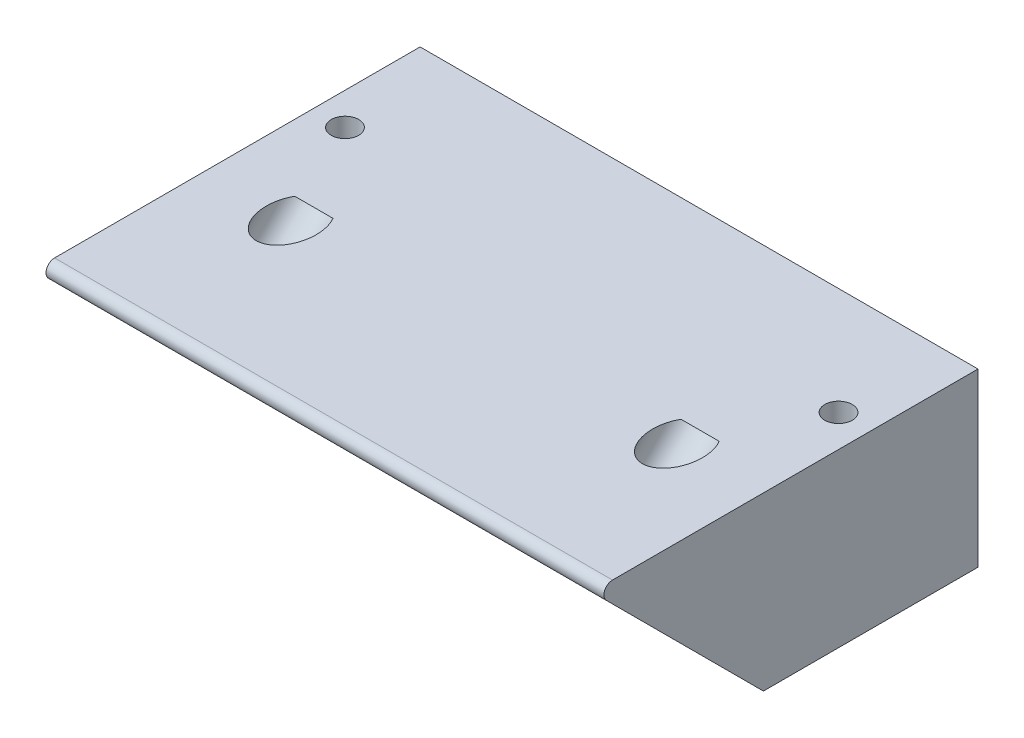
ISO-10303-21;
HEADER;
FILE_DESCRIPTION(('STEP AP214'),'2;1');
FILE_NAME('part.step','',(''),(''),'','','');
FILE_SCHEMA(('AUTOMOTIVE_DESIGN { 1 0 10303 214 1 1 1 1 }'));
ENDSEC;
DATA;
#1=APPLICATION_CONTEXT('core data for automotive mechanical design processes');
#2=APPLICATION_PROTOCOL_DEFINITION('international standard','automotive_design',2000,#1);
#3=PRODUCT_CONTEXT('',#1,'mechanical');
#4=PRODUCT('Part','Part','',(#3));
#5=PRODUCT_RELATED_PRODUCT_CATEGORY('part','',(#4));
#6=PRODUCT_DEFINITION_FORMATION('','',#4);
#7=PRODUCT_DEFINITION_CONTEXT('part definition',#1,'design');
#8=PRODUCT_DEFINITION('design','',#6,#7);
#9=PRODUCT_DEFINITION_SHAPE('','',#8);
#10=(LENGTH_UNIT() NAMED_UNIT(*) SI_UNIT(.MILLI.,.METRE.));
#11=(NAMED_UNIT(*) PLANE_ANGLE_UNIT() SI_UNIT($,.RADIAN.));
#12=(NAMED_UNIT(*) SI_UNIT($,.STERADIAN.) SOLID_ANGLE_UNIT());
#13=UNCERTAINTY_MEASURE_WITH_UNIT(LENGTH_MEASURE(1.E-05),#10,'distance_accuracy_value','');
#14=(GEOMETRIC_REPRESENTATION_CONTEXT(3) GLOBAL_UNCERTAINTY_ASSIGNED_CONTEXT((#13)) GLOBAL_UNIT_ASSIGNED_CONTEXT((#10,
#11,#12)) REPRESENTATION_CONTEXT('',''));
#15=CARTESIAN_POINT('',(0.,0.,0.));
#16=DIRECTION('',(0.,0.,1.));
#17=DIRECTION('',(1.,0.,0.));
#18=AXIS2_PLACEMENT_3D('',#15,#16,#17);
#19=CARTESIAN_POINT('',(22.5,32.5,0.));
#20=DIRECTION('',(0.,-0.707106781186549,0.707106781186546));
#21=DIRECTION('',(0.,-0.707106781186546,-0.707106781186549));
#22=AXIS2_PLACEMENT_3D('',#19,#20,#21);
#23=CYLINDRICAL_SURFACE('',#22,1.6);
#24=CARTESIAN_POINT('',(22.5,10.,22.5));
#25=DIRECTION('',(0.,-0.707106781186549,0.707106781186546));
#26=DIRECTION('',(0.,-0.707106781186546,-0.707106781186549));
#27=AXIS2_PLACEMENT_3D('',#24,#25,#26);
#28=CIRCLE('',#27,1.6);
#29=CARTESIAN_POINT('',(22.5,8.86862915010152,21.3686291501016));
#30=VERTEX_POINT('',#29);
#31=EDGE_CURVE('E216',#30,#30,#28,.T.);
#32=CARTESIAN_POINT('',(22.5,14.9497474683058,17.5502525316942));
#33=DIRECTION('',(0.,0.707106781186549,-0.707106781186546));
#34=DIRECTION('',(0.,0.707106781186546,0.707106781186549));
#35=AXIS2_PLACEMENT_3D('',#32,#33,#34);
#36=CIRCLE('',#35,1.6);
#37=CARTESIAN_POINT('',(22.5,13.8183766184074,16.4188816817957));
#38=VERTEX_POINT('',#37);
#39=EDGE_CURVE('E221',#38,#38,#36,.F.);
#40=CARTESIAN_POINT('',(22.5,8.86862915010152,21.3686291501016));
#41=CARTESIAN_POINT('',(22.5,8.92018901956304,21.31706928064));
#42=CARTESIAN_POINT('',(22.5,8.97174888902456,21.2655094111785));
#43=CARTESIAN_POINT('',(22.5,9.0748686279476,21.1623896722555));
#44=CARTESIAN_POINT('',(22.5,9.12642849740912,21.110829802794));
#45=CARTESIAN_POINT('',(22.5,9.22954823633216,21.0077100638709));
#46=CARTESIAN_POINT('',(22.5,9.28110810579368,20.9561501944094));
#47=CARTESIAN_POINT('',(22.5,9.38422784471672,20.8530304554864));
#48=CARTESIAN_POINT('',(22.5,9.43578771417824,20.8014705860248));
#49=CARTESIAN_POINT('',(22.5,9.53890745310128,20.6983508471018));
#50=CARTESIAN_POINT('',(22.5,9.59046732256279,20.6467909776403));
#51=CARTESIAN_POINT('',(22.5,9.69358706148583,20.5436712387173));
#52=CARTESIAN_POINT('',(22.5,9.74514693094735,20.4921113692557));
#53=CARTESIAN_POINT('',(22.5,9.84826666987039,20.3889916303327));
#54=CARTESIAN_POINT('',(22.5,9.89982653933191,20.3374317608712));
#55=CARTESIAN_POINT('',(22.5,10.0029462782549,20.2343120219481));
#56=CARTESIAN_POINT('',(22.5,10.0545061477165,20.1827521524866));
#57=CARTESIAN_POINT('',(22.5,10.1576258866395,20.0796324135636));
#58=CARTESIAN_POINT('',(22.5,10.209185756101,20.0280725441021));
#59=CARTESIAN_POINT('',(22.5,10.3123054950241,19.924952805179));
#60=CARTESIAN_POINT('',(22.5,10.3638653644856,19.8733929357175));
#61=CARTESIAN_POINT('',(22.5,10.4669851034086,19.7702731967945));
#62=CARTESIAN_POINT('',(22.5,10.5185449728701,19.718713327333));
#63=CARTESIAN_POINT('',(22.5,10.6216647117932,19.6155935884099));
#64=CARTESIAN_POINT('',(22.5,10.6732245812547,19.5640337189484));
#65=CARTESIAN_POINT('',(22.5,10.7763443201777,19.4609139800254));
#66=CARTESIAN_POINT('',(22.5,10.8279041896393,19.4093541105638));
#67=CARTESIAN_POINT('',(22.5,10.9310239285623,19.3062343716408));
#68=CARTESIAN_POINT('',(22.5,10.9825837980238,19.2546745021793));
#69=CARTESIAN_POINT('',(22.5,11.0857035369469,19.1515547632562));
#70=CARTESIAN_POINT('',(22.5,11.1372634064084,19.0999948937947));
#71=CARTESIAN_POINT('',(22.5,11.2403831453314,18.9968751548717));
#72=CARTESIAN_POINT('',(22.5,11.2919430147929,18.9453152854102));
#73=CARTESIAN_POINT('',(22.5,11.395062753716,18.8421955464871));
#74=CARTESIAN_POINT('',(22.5,11.4466226231775,18.7906356770256));
#75=CARTESIAN_POINT('',(22.5,11.5497423621005,18.6875159381026));
#76=CARTESIAN_POINT('',(22.5,11.601302231562,18.6359560686411));
#77=CARTESIAN_POINT('',(22.5,11.7044219704851,18.532836329718));
#78=CARTESIAN_POINT('',(22.5,11.7559818399466,18.4812764602565));
#79=CARTESIAN_POINT('',(22.5,11.8591015788696,18.3781567213335));
#80=CARTESIAN_POINT('',(22.5,11.9106614483312,18.3265968518719));
#81=CARTESIAN_POINT('',(22.5,12.0137811872542,18.2234771129489));
#82=CARTESIAN_POINT('',(22.5,12.0653410567157,18.1719172434874));
#83=CARTESIAN_POINT('',(22.5,12.1684607956388,18.0687975045643));
#84=CARTESIAN_POINT('',(22.5,12.2200206651003,18.0172376351028));
#85=CARTESIAN_POINT('',(22.5,12.3231404040233,17.9141178961798));
#86=CARTESIAN_POINT('',(22.5,12.3747002734848,17.8625580267183));
#87=CARTESIAN_POINT('',(22.5,12.4778200124079,17.7594382877952));
#88=CARTESIAN_POINT('',(22.5,12.5293798818694,17.7078784183337));
#89=CARTESIAN_POINT('',(22.5,12.6324996207924,17.6047586794107));
#90=CARTESIAN_POINT('',(22.5,12.6840594902539,17.5531988099492));
#91=CARTESIAN_POINT('',(22.5,12.787179229177,17.4500790710261));
#92=CARTESIAN_POINT('',(22.5,12.8387390986385,17.3985192015646));
#93=CARTESIAN_POINT('',(22.5,12.9418588375615,17.2953994626416));
#94=CARTESIAN_POINT('',(22.5,12.9934187070231,17.24383959318));
#95=CARTESIAN_POINT('',(22.5,13.0965384459461,17.140719854257));
#96=CARTESIAN_POINT('',(22.5,13.1480983154076,17.0891599847955));
#97=CARTESIAN_POINT('',(22.5,13.2512180543307,16.9860402458724));
#98=CARTESIAN_POINT('',(22.5,13.3027779237922,16.9344803764109));
#99=CARTESIAN_POINT('',(22.5,13.4058976627152,16.8313606374879));
#100=CARTESIAN_POINT('',(22.5,13.4574575321767,16.7798007680264));
#101=CARTESIAN_POINT('',(22.5,13.5605772710998,16.6766810291033));
#102=CARTESIAN_POINT('',(22.5,13.6121371405613,16.6251211596418));
#103=CARTESIAN_POINT('',(22.5,13.7152568794843,16.5220014207188));
#104=CARTESIAN_POINT('',(22.5,13.7668167489458,16.4704415512573));
#105=CARTESIAN_POINT('',(22.5,13.8183766184074,16.4188816817957));
#106=B_SPLINE_CURVE_WITH_KNOTS('',3,(#40,#41,#42,#43,#44,#45,#46,#47,#48,#49,#50,#51,#52,#53,
#54,#55,#56,#57,#58,#59,#60,#61,#62,#63,#64,#65,#66,#67,#68,#69,#70,#71,#72,#73,#74,#75,#76,#77,
#78,#79,#80,#81,#82,#83,#84,#85,#86,#87,#88,#89,#90,#91,#92,#93,#94,#95,#96,#97,#98,#99,#100,
#101,#102,#103,#104,#105),.UNSPECIFIED.,.F.,.F.,(4,2,2,2,2,2,2,2,2,2,2,2,2,2,2,2,2,2,2,2,2,2,2,
2,2,2,2,2,2,2,2,2,4),(0.,0.218749999999998,0.437500000000003,0.656250000000001,
0.875000000000002,1.09375,1.3125,1.53125,1.75,1.96875,2.1875,2.40625,2.625,2.84375,3.0625,
3.28125,3.5,3.71875,3.9375,4.15625,4.375,4.59375,4.8125,5.03125,5.25,5.46875,5.6875,5.90625,
6.125,6.34375,6.5625,6.78124999999999,7.),.UNSPECIFIED.);
#107=EDGE_CURVE('BSEAM44',#30,#38,#106,.T.);
#108=ORIENTED_EDGE('',*,*,#31,.T.);
#109=ORIENTED_EDGE('',*,*,#39,.F.);
#110=ORIENTED_EDGE('',*,*,#107,.T.);
#111=ORIENTED_EDGE('',*,*,#107,.F.);
#112=EDGE_LOOP('',(#108,#110,#109,#111));
#113=FACE_BOUND('',#112,.T.);
#114=ADVANCED_FACE('F44',(#113),#23,.F.);
#115=CARTESIAN_POINT('',(32.5,20.,12.5));
#116=DIRECTION('',(-1.,0.,0.));
#117=DIRECTION('',(0.,0.,1.));
#118=AXIS2_PLACEMENT_3D('',#115,#116,#117);
#119=PLANE('',#118);
#120=DIRECTION('',(0.,0.,-1.));
#121=VECTOR('',#120,1.);
#122=CARTESIAN_POINT('',(32.5,20.,12.5));
#123=LINE('',#122,#121);
#124=CARTESIAN_POINT('',(32.5,20.,30.085786437627));
#125=VERTEX_POINT('',#124);
#126=CARTESIAN_POINT('',(32.5,20.,-12.5));
#127=VERTEX_POINT('',#126);
#128=EDGE_CURVE('E172',#125,#127,#123,.T.);
#129=ORIENTED_EDGE('',*,*,#128,.F.);
#130=CARTESIAN_POINT('',(32.5,19.,30.085786437627));
#131=DIRECTION('',(-1.,0.,0.));
#132=DIRECTION('',(0.,0.,1.));
#133=AXIS2_PLACEMENT_3D('',#130,#131,#132);
#134=CIRCLE('',#133,1.);
#135=CARTESIAN_POINT('',(32.5,18.2928932188135,30.7928932188135));
#136=VERTEX_POINT('',#135);
#137=EDGE_CURVE('E67',#125,#136,#134,.F.);
#138=ORIENTED_EDGE('',*,*,#137,.T.);
#139=DIRECTION('',(0.,-0.707106781186546,-0.707106781186549));
#140=VECTOR('',#139,1.);
#141=CARTESIAN_POINT('',(32.5,0.,12.5));
#142=LINE('',#141,#140);
#143=CARTESIAN_POINT('',(32.5,0.,12.5));
#144=VERTEX_POINT('',#143);
#145=EDGE_CURVE('E193',#136,#144,#142,.T.);
#146=ORIENTED_EDGE('',*,*,#145,.T.);
#147=DIRECTION('',(0.,0.,-1.));
#148=VECTOR('',#147,1.);
#149=CARTESIAN_POINT('',(32.5,0.,12.5));
#150=LINE('',#149,#148);
#151=CARTESIAN_POINT('',(32.5,0.,-12.5));
#152=VERTEX_POINT('',#151);
#153=EDGE_CURVE('E199',#144,#152,#150,.T.);
#154=ORIENTED_EDGE('',*,*,#153,.T.);
#155=DIRECTION('',(0.,-1.,0.));
#156=VECTOR('',#155,1.);
#157=CARTESIAN_POINT('',(32.5,20.,-12.5));
#158=LINE('',#157,#156);
#159=EDGE_CURVE('E135',#127,#152,#158,.T.);
#160=ORIENTED_EDGE('',*,*,#159,.F.);
#161=EDGE_LOOP('',(#129,#138,#146,#154,#160));
#162=FACE_BOUND('',#161,.T.);
#163=ADVANCED_FACE('F179',(#162),#119,.F.);
#164=CARTESIAN_POINT('',(-32.5,20.,-12.5));
#165=DIRECTION('',(0.,0.,1.));
#166=DIRECTION('',(1.,0.,0.));
#167=AXIS2_PLACEMENT_3D('',#164,#165,#166);
#168=PLANE('',#167);
#169=DIRECTION('',(1.,0.,0.));
#170=VECTOR('',#169,1.);
#171=CARTESIAN_POINT('',(-25.,15.,-12.5));
#172=LINE('',#171,#170);
#173=CARTESIAN_POINT('',(-25.,15.,-12.5));
#174=VERTEX_POINT('',#173);
#175=CARTESIAN_POINT('',(25.,15.,-12.5));
#176=VERTEX_POINT('',#175);
#177=EDGE_CURVE('E287',#174,#176,#172,.T.);
#178=ORIENTED_EDGE('',*,*,#177,.F.);
#179=DIRECTION('',(0.,-1.,0.));
#180=VECTOR('',#179,1.);
#181=CARTESIAN_POINT('',(-25.,15.,-12.5));
#182=LINE('',#181,#180);
#183=CARTESIAN_POINT('',(-25.,0.,-12.5));
#184=VERTEX_POINT('',#183);
#185=EDGE_CURVE('E288',#174,#184,#182,.T.);
#186=ORIENTED_EDGE('',*,*,#185,.T.);
#187=DIRECTION('',(-1.,0.,0.));
#188=VECTOR('',#187,1.);
#189=CARTESIAN_POINT('',(-32.5,0.,-12.5));
#190=LINE('',#189,#188);
#191=CARTESIAN_POINT('',(-32.5,0.,-12.5));
#192=VERTEX_POINT('',#191);
#193=EDGE_CURVE('E202',#184,#192,#190,.T.);
#194=ORIENTED_EDGE('',*,*,#193,.T.);
#195=DIRECTION('',(0.,-1.,0.));
#196=VECTOR('',#195,1.);
#197=CARTESIAN_POINT('',(-32.5,20.,-12.5));
#198=LINE('',#197,#196);
#199=CARTESIAN_POINT('',(-32.5,20.,-12.5));
#200=VERTEX_POINT('',#199);
#201=EDGE_CURVE('E198',#200,#192,#198,.T.);
#202=ORIENTED_EDGE('',*,*,#201,.F.);
#203=DIRECTION('',(-1.,0.,0.));
#204=VECTOR('',#203,1.);
#205=CARTESIAN_POINT('',(-32.5,20.,-12.5));
#206=LINE('',#205,#204);
#207=EDGE_CURVE('E183',#127,#200,#206,.T.);
#208=ORIENTED_EDGE('',*,*,#207,.F.);
#209=ORIENTED_EDGE('',*,*,#159,.T.);
#210=CARTESIAN_POINT('',(25.,0.,-12.5));
#211=VERTEX_POINT('',#210);
#212=EDGE_CURVE('E204',#152,#211,#190,.T.);
#213=ORIENTED_EDGE('',*,*,#212,.T.);
#214=DIRECTION('',(0.,-1.,0.));
#215=VECTOR('',#214,1.);
#216=CARTESIAN_POINT('',(25.,15.,-12.5));
#217=LINE('',#216,#215);
#218=EDGE_CURVE('E290',#176,#211,#217,.T.);
#219=ORIENTED_EDGE('',*,*,#218,.F.);
#220=EDGE_LOOP('',(#178,#186,#194,#202,#208,#209,#213,#219));
#221=FACE_BOUND('',#220,.T.);
#222=ADVANCED_FACE('F244',(#221),#168,.F.);
#223=CARTESIAN_POINT('',(-32.5,20.,12.5));
#224=DIRECTION('',(1.,0.,0.));
#225=DIRECTION('',(0.,0.,-1.));
#226=AXIS2_PLACEMENT_3D('',#223,#224,#225);
#227=PLANE('',#226);
#228=DIRECTION('',(0.,0.707106781186546,0.707106781186549));
#229=VECTOR('',#228,1.);
#230=CARTESIAN_POINT('',(-32.5,0.,12.5));
#231=LINE('',#230,#229);
#232=CARTESIAN_POINT('',(-32.5,0.,12.5));
#233=VERTEX_POINT('',#232);
#234=CARTESIAN_POINT('',(-32.5,18.2928932188135,30.7928932188135));
#235=VERTEX_POINT('',#234);
#236=EDGE_CURVE('E203',#233,#235,#231,.T.);
#237=ORIENTED_EDGE('',*,*,#236,.T.);
#238=CARTESIAN_POINT('',(-32.5,19.,30.085786437627));
#239=DIRECTION('',(1.,0.,0.));
#240=DIRECTION('',(0.,0.,-1.));
#241=AXIS2_PLACEMENT_3D('',#238,#239,#240);
#242=CIRCLE('',#241,1.);
#243=CARTESIAN_POINT('',(-32.5,20.,30.085786437627));
#244=VERTEX_POINT('',#243);
#245=EDGE_CURVE('E11',#235,#244,#242,.F.);
#246=ORIENTED_EDGE('',*,*,#245,.T.);
#247=DIRECTION('',(0.,0.,1.));
#248=VECTOR('',#247,1.);
#249=CARTESIAN_POINT('',(-32.5,20.,12.5));
#250=LINE('',#249,#248);
#251=EDGE_CURVE('E175',#200,#244,#250,.T.);
#252=ORIENTED_EDGE('',*,*,#251,.F.);
#253=ORIENTED_EDGE('',*,*,#201,.T.);
#254=DIRECTION('',(0.,0.,1.));
#255=VECTOR('',#254,1.);
#256=CARTESIAN_POINT('',(-32.5,0.,12.5));
#257=LINE('',#256,#255);
#258=EDGE_CURVE('E190',#192,#233,#257,.T.);
#259=ORIENTED_EDGE('',*,*,#258,.T.);
#260=EDGE_LOOP('',(#237,#246,#252,#253,#259));
#261=FACE_BOUND('',#260,.T.);
#262=ADVANCED_FACE('F271',(#261),#227,.F.);
#263=CARTESIAN_POINT('',(0.,20.,0.));
#264=DIRECTION('',(0.,-1.,0.));
#265=DIRECTION('',(0.,0.,-1.));
#266=AXIS2_PLACEMENT_3D('',#263,#264,#265);
#267=PLANE('',#266);
#268=CARTESIAN_POINT('',(-28.75,20.,0.));
#269=DIRECTION('',(0.,-1.,0.));
#270=DIRECTION('',(0.,0.,-1.));
#271=AXIS2_PLACEMENT_3D('',#268,#269,#270);
#272=CIRCLE('',#271,1.6);
#273=CARTESIAN_POINT('',(-28.75,20.,-1.6));
#274=VERTEX_POINT('',#273);
#275=EDGE_CURVE('E161',#274,#274,#272,.T.);
#276=ORIENTED_EDGE('',*,*,#275,.T.);
#277=EDGE_LOOP('',(#276));
#278=FACE_BOUND('',#277,.T.);
#279=CARTESIAN_POINT('',(28.75,20.,0.));
#280=DIRECTION('',(0.,-1.,0.));
#281=DIRECTION('',(0.,0.,1.));
#282=AXIS2_PLACEMENT_3D('',#279,#280,#281);
#283=CIRCLE('',#282,1.6);
#284=CARTESIAN_POINT('',(28.75,20.,1.59999999999999));
#285=VERTEX_POINT('',#284);
#286=EDGE_CURVE('E512',#285,#285,#283,.T.);
#287=ORIENTED_EDGE('',*,*,#286,.T.);
#288=EDGE_LOOP('',(#287));
#289=FACE_BOUND('',#288,.T.);
#290=DIRECTION('',(-1.,0.,0.));
#291=VECTOR('',#290,1.);
#292=CARTESIAN_POINT('',(0.,20.,9.87258300203052));
#293=LINE('',#292,#291);
#294=CARTESIAN_POINT('',(-20.2732669761756,20.,9.87258300203052));
#295=VERTEX_POINT('',#294);
#296=CARTESIAN_POINT('',(-24.7267330238244,20.,9.87258300203052));
#297=VERTEX_POINT('',#296);
#298=EDGE_CURVE('E146',#295,#297,#293,.T.);
#299=ORIENTED_EDGE('',*,*,#298,.F.);
#300=CARTESIAN_POINT('',(-22.5,20.,12.5000000000001));
#301=DIRECTION('',(0.,-1.,0.));
#302=DIRECTION('',(0.,0.,1.));
#303=AXIS2_PLACEMENT_3D('',#300,#301,#302);
#304=ELLIPSE('',#303,4.10121933088197,2.9);
#305=EDGE_CURVE('E149',#295,#297,#304,.T.);
#306=ORIENTED_EDGE('',*,*,#305,.T.);
#307=EDGE_LOOP('',(#299,#306));
#308=FACE_BOUND('',#307,.T.);
#309=DIRECTION('',(1.,0.,0.));
#310=VECTOR('',#309,1.);
#311=CARTESIAN_POINT('',(0.,20.,9.87258300203052));
#312=LINE('',#311,#310);
#313=CARTESIAN_POINT('',(20.2732669761756,20.,9.87258300203052));
#314=VERTEX_POINT('',#313);
#315=CARTESIAN_POINT('',(24.7267330238244,20.,9.87258300203052));
#316=VERTEX_POINT('',#315);
#317=EDGE_CURVE('E126',#314,#316,#312,.T.);
#318=ORIENTED_EDGE('',*,*,#317,.T.);
#319=CARTESIAN_POINT('',(22.5,20.,12.5000000000001));
#320=DIRECTION('',(0.,-1.,0.));
#321=DIRECTION('',(0.,0.,1.));
#322=AXIS2_PLACEMENT_3D('',#319,#320,#321);
#323=ELLIPSE('',#322,4.10121933088197,2.9);
#324=EDGE_CURVE('E134',#316,#314,#323,.T.);
#325=ORIENTED_EDGE('',*,*,#324,.T.);
#326=EDGE_LOOP('',(#318,#325));
#327=FACE_BOUND('',#326,.T.);
#328=ORIENTED_EDGE('',*,*,#251,.T.);
#329=DIRECTION('',(1.,0.,0.));
#330=VECTOR('',#329,1.);
#331=CARTESIAN_POINT('',(32.5,20.,30.085786437627));
#332=LINE('',#331,#330);
#333=EDGE_CURVE('E156',#244,#125,#332,.T.);
#334=ORIENTED_EDGE('',*,*,#333,.T.);
#335=ORIENTED_EDGE('',*,*,#128,.T.);
#336=ORIENTED_EDGE('',*,*,#207,.T.);
#337=EDGE_LOOP('',(#328,#334,#335,#336));
#338=FACE_BOUND('',#337,.T.);
#339=ADVANCED_FACE('F143',(#278,#289,#308,#327,#338),#267,.F.);
#340=CARTESIAN_POINT('',(0.,0.,0.));
#341=DIRECTION('',(0.,-1.,0.));
#342=DIRECTION('',(0.,0.,-1.));
#343=AXIS2_PLACEMENT_3D('',#340,#341,#342);
#344=PLANE('',#343);
#345=CARTESIAN_POINT('',(-28.75,0.,0.));
#346=DIRECTION('',(0.,-1.,0.));
#347=DIRECTION('',(0.,0.,-1.));
#348=AXIS2_PLACEMENT_3D('',#345,#346,#347);
#349=CIRCLE('',#348,1.6);
#350=CARTESIAN_POINT('',(-28.75,0.,-1.6));
#351=VERTEX_POINT('',#350);
#352=EDGE_CURVE('E141',#351,#351,#349,.T.);
#353=ORIENTED_EDGE('',*,*,#352,.F.);
#354=EDGE_LOOP('',(#353));
#355=FACE_BOUND('',#354,.T.);
#356=CARTESIAN_POINT('',(28.75,0.,0.));
#357=DIRECTION('',(0.,-1.,0.));
#358=DIRECTION('',(0.,0.,-1.));
#359=AXIS2_PLACEMENT_3D('',#356,#357,#358);
#360=CIRCLE('',#359,1.6);
#361=CARTESIAN_POINT('',(28.75,0.,-1.60000000000002));
#362=VERTEX_POINT('',#361);
#363=EDGE_CURVE('E157',#362,#362,#360,.T.);
#364=ORIENTED_EDGE('',*,*,#363,.F.);
#365=EDGE_LOOP('',(#364));
#366=FACE_BOUND('',#365,.T.);
#367=DIRECTION('',(0.,0.,-1.));
#368=VECTOR('',#367,1.);
#369=CARTESIAN_POINT('',(-25.,0.,-12.5));
#370=LINE('',#369,#368);
#371=CARTESIAN_POINT('',(-25.,0.,7.49999999999999));
#372=VERTEX_POINT('',#371);
#373=EDGE_CURVE('E225',#372,#184,#370,.T.);
#374=ORIENTED_EDGE('',*,*,#373,.F.);
#375=DIRECTION('',(-1.,0.,0.));
#376=VECTOR('',#375,1.);
#377=CARTESIAN_POINT('',(-25.,0.,7.49999999999999));
#378=LINE('',#377,#376);
#379=CARTESIAN_POINT('',(25.,0.,7.5));
#380=VERTEX_POINT('',#379);
#381=EDGE_CURVE('E301',#380,#372,#378,.T.);
#382=ORIENTED_EDGE('',*,*,#381,.F.);
#383=DIRECTION('',(0.,0.,1.));
#384=VECTOR('',#383,1.);
#385=CARTESIAN_POINT('',(25.,0.,-12.5));
#386=LINE('',#385,#384);
#387=EDGE_CURVE('E309',#211,#380,#386,.T.);
#388=ORIENTED_EDGE('',*,*,#387,.F.);
#389=ORIENTED_EDGE('',*,*,#212,.F.);
#390=ORIENTED_EDGE('',*,*,#153,.F.);
#391=DIRECTION('',(1.,0.,0.));
#392=VECTOR('',#391,1.);
#393=CARTESIAN_POINT('',(-32.5,0.,12.5));
#394=LINE('',#393,#392);
#395=EDGE_CURVE('E184',#233,#144,#394,.T.);
#396=ORIENTED_EDGE('',*,*,#395,.F.);
#397=ORIENTED_EDGE('',*,*,#258,.F.);
#398=ORIENTED_EDGE('',*,*,#193,.F.);
#399=EDGE_LOOP('',(#374,#382,#388,#389,#390,#396,#397,#398));
#400=FACE_BOUND('',#399,.T.);
#401=ADVANCED_FACE('F267',(#355,#366,#400),#344,.T.);
#402=CARTESIAN_POINT('',(-60.784271247462,0.,12.5));
#403=DIRECTION('',(0.,-0.707106781186549,0.707106781186546));
#404=DIRECTION('',(0.,-0.707106781186546,-0.707106781186549));
#405=AXIS2_PLACEMENT_3D('',#402,#403,#404);
#406=PLANE('',#405);
#407=CARTESIAN_POINT('',(-22.5,10.,22.5));
#408=DIRECTION('',(0.,-0.707106781186549,0.707106781186546));
#409=DIRECTION('',(0.,-0.707106781186546,-0.707106781186549));
#410=AXIS2_PLACEMENT_3D('',#407,#408,#409);
#411=CIRCLE('',#410,1.6);
#412=CARTESIAN_POINT('',(-22.5,8.86862915010152,21.3686291501016));
#413=VERTEX_POINT('',#412);
#414=EDGE_CURVE('E220',#413,#413,#411,.T.);
#415=ORIENTED_EDGE('',*,*,#414,.F.);
#416=EDGE_LOOP('',(#415));
#417=FACE_BOUND('',#416,.T.);
#418=ORIENTED_EDGE('',*,*,#31,.F.);
#419=EDGE_LOOP('',(#418));
#420=FACE_BOUND('',#419,.T.);
#421=ORIENTED_EDGE('',*,*,#145,.F.);
#422=DIRECTION('',(1.,0.,0.));
#423=VECTOR('',#422,1.);
#424=CARTESIAN_POINT('',(-32.5,18.2928932188135,30.7928932188135));
#425=LINE('',#424,#423);
#426=EDGE_CURVE('E53',#136,#235,#425,.F.);
#427=ORIENTED_EDGE('',*,*,#426,.T.);
#428=ORIENTED_EDGE('',*,*,#236,.F.);
#429=ORIENTED_EDGE('',*,*,#395,.T.);
#430=EDGE_LOOP('',(#421,#427,#428,#429));
#431=FACE_BOUND('',#430,.T.);
#432=ADVANCED_FACE('F263',(#417,#420,#431),#406,.T.);
#433=CARTESIAN_POINT('',(-25.,15.,-12.5));
#434=DIRECTION('',(-1.,0.,0.));
#435=DIRECTION('',(0.,0.,1.));
#436=AXIS2_PLACEMENT_3D('',#433,#434,#435);
#437=PLANE('',#436);
#438=ORIENTED_EDGE('',*,*,#373,.T.);
#439=ORIENTED_EDGE('',*,*,#185,.F.);
#440=DIRECTION('',(0.,0.,-1.));
#441=VECTOR('',#440,1.);
#442=CARTESIAN_POINT('',(-25.,15.,-12.5));
#443=LINE('',#442,#441);
#444=CARTESIAN_POINT('',(-25.,15.,7.49999999999999));
#445=VERTEX_POINT('',#444);
#446=EDGE_CURVE('E295',#445,#174,#443,.T.);
#447=ORIENTED_EDGE('',*,*,#446,.F.);
#448=DIRECTION('',(0.,-1.,0.));
#449=VECTOR('',#448,1.);
#450=CARTESIAN_POINT('',(-25.,15.,7.49999999999999));
#451=LINE('',#450,#449);
#452=EDGE_CURVE('E316',#445,#372,#451,.T.);
#453=ORIENTED_EDGE('',*,*,#452,.T.);
#454=EDGE_LOOP('',(#438,#439,#447,#453));
#455=FACE_BOUND('',#454,.T.);
#456=ADVANCED_FACE('F256',(#455),#437,.F.);
#457=CARTESIAN_POINT('',(-25.,15.,7.49999999999999));
#458=DIRECTION('',(0.,0.,1.));
#459=DIRECTION('',(1.,0.,0.));
#460=AXIS2_PLACEMENT_3D('',#457,#458,#459);
#461=PLANE('',#460);
#462=ORIENTED_EDGE('',*,*,#381,.T.);
#463=ORIENTED_EDGE('',*,*,#452,.F.);
#464=DIRECTION('',(-1.,0.,0.));
#465=VECTOR('',#464,1.);
#466=CARTESIAN_POINT('',(-25.,15.,7.49999999999999));
#467=LINE('',#466,#465);
#468=CARTESIAN_POINT('',(25.,15.,7.5));
#469=VERTEX_POINT('',#468);
#470=EDGE_CURVE('E299',#469,#445,#467,.T.);
#471=ORIENTED_EDGE('',*,*,#470,.F.);
#472=DIRECTION('',(0.,-1.,0.));
#473=VECTOR('',#472,1.);
#474=CARTESIAN_POINT('',(25.,15.,7.5));
#475=LINE('',#474,#473);
#476=EDGE_CURVE('E319',#469,#380,#475,.T.);
#477=ORIENTED_EDGE('',*,*,#476,.T.);
#478=EDGE_LOOP('',(#462,#463,#471,#477));
#479=FACE_BOUND('',#478,.T.);
#480=ADVANCED_FACE('F253',(#479),#461,.F.);
#481=CARTESIAN_POINT('',(25.,15.,-12.5));
#482=DIRECTION('',(1.,0.,0.));
#483=DIRECTION('',(0.,0.,-1.));
#484=AXIS2_PLACEMENT_3D('',#481,#482,#483);
#485=PLANE('',#484);
#486=ORIENTED_EDGE('',*,*,#387,.T.);
#487=ORIENTED_EDGE('',*,*,#476,.F.);
#488=DIRECTION('',(0.,0.,1.));
#489=VECTOR('',#488,1.);
#490=CARTESIAN_POINT('',(25.,15.,-12.5));
#491=LINE('',#490,#489);
#492=EDGE_CURVE('E294',#176,#469,#491,.T.);
#493=ORIENTED_EDGE('',*,*,#492,.F.);
#494=ORIENTED_EDGE('',*,*,#218,.T.);
#495=EDGE_LOOP('',(#486,#487,#493,#494));
#496=FACE_BOUND('',#495,.T.);
#497=ADVANCED_FACE('F251',(#496),#485,.F.);
#498=CARTESIAN_POINT('',(0.,15.,0.));
#499=DIRECTION('',(0.,1.,0.));
#500=DIRECTION('',(0.,0.,1.));
#501=AXIS2_PLACEMENT_3D('',#498,#499,#500);
#502=PLANE('',#501);
#503=ORIENTED_EDGE('',*,*,#446,.T.);
#504=ORIENTED_EDGE('',*,*,#177,.T.);
#505=ORIENTED_EDGE('',*,*,#492,.T.);
#506=ORIENTED_EDGE('',*,*,#470,.T.);
#507=EDGE_LOOP('',(#503,#504,#505,#506));
#508=FACE_BOUND('',#507,.T.);
#509=ADVANCED_FACE('F249',(#508),#502,.F.);
#510=CARTESIAN_POINT('',(-22.5,32.5,0.));
#511=DIRECTION('',(0.,-0.707106781186549,0.707106781186546));
#512=DIRECTION('',(0.,-0.707106781186546,-0.707106781186549));
#513=AXIS2_PLACEMENT_3D('',#510,#511,#512);
#514=CYLINDRICAL_SURFACE('',#513,1.6);
#515=CARTESIAN_POINT('',(-22.5,14.9497474683058,17.5502525316942));
#516=DIRECTION('',(0.,-0.707106781186549,0.707106781186546));
#517=DIRECTION('',(0.,-0.707106781186546,-0.707106781186549));
#518=AXIS2_PLACEMENT_3D('',#515,#516,#517);
#519=CIRCLE('',#518,1.6);
#520=CARTESIAN_POINT('',(-22.5,13.8183766184074,16.4188816817957));
#521=VERTEX_POINT('',#520);
#522=EDGE_CURVE('E226',#521,#521,#519,.F.);
#523=CARTESIAN_POINT('',(-22.5,13.8183766184074,16.4188816817957));
#524=CARTESIAN_POINT('',(-22.5,13.7668167489458,16.4704415512573));
#525=CARTESIAN_POINT('',(-22.5,13.7152568794843,16.5220014207188));
#526=CARTESIAN_POINT('',(-22.5,13.6121371405613,16.6251211596418));
#527=CARTESIAN_POINT('',(-22.5,13.5605772710998,16.6766810291033));
#528=CARTESIAN_POINT('',(-22.5,13.4574575321767,16.7798007680264));
#529=CARTESIAN_POINT('',(-22.5,13.4058976627152,16.8313606374879));
#530=CARTESIAN_POINT('',(-22.5,13.3027779237922,16.9344803764109));
#531=CARTESIAN_POINT('',(-22.5,13.2512180543307,16.9860402458724));
#532=CARTESIAN_POINT('',(-22.5,13.1480983154076,17.0891599847955));
#533=CARTESIAN_POINT('',(-22.5,13.0965384459461,17.140719854257));
#534=CARTESIAN_POINT('',(-22.5,12.9934187070231,17.24383959318));
#535=CARTESIAN_POINT('',(-22.5,12.9418588375615,17.2953994626416));
#536=CARTESIAN_POINT('',(-22.5,12.8387390986385,17.3985192015646));
#537=CARTESIAN_POINT('',(-22.5,12.787179229177,17.4500790710261));
#538=CARTESIAN_POINT('',(-22.5,12.6840594902539,17.5531988099492));
#539=CARTESIAN_POINT('',(-22.5,12.6324996207924,17.6047586794107));
#540=CARTESIAN_POINT('',(-22.5,12.5293798818694,17.7078784183337));
#541=CARTESIAN_POINT('',(-22.5,12.4778200124079,17.7594382877952));
#542=CARTESIAN_POINT('',(-22.5,12.3747002734848,17.8625580267183));
#543=CARTESIAN_POINT('',(-22.5,12.3231404040233,17.9141178961798));
#544=CARTESIAN_POINT('',(-22.5,12.2200206651003,18.0172376351028));
#545=CARTESIAN_POINT('',(-22.5,12.1684607956388,18.0687975045643));
#546=CARTESIAN_POINT('',(-22.5,12.0653410567157,18.1719172434874));
#547=CARTESIAN_POINT('',(-22.5,12.0137811872542,18.2234771129489));
#548=CARTESIAN_POINT('',(-22.5,11.9106614483312,18.3265968518719));
#549=CARTESIAN_POINT('',(-22.5,11.8591015788696,18.3781567213335));
#550=CARTESIAN_POINT('',(-22.5,11.7559818399466,18.4812764602565));
#551=CARTESIAN_POINT('',(-22.5,11.7044219704851,18.532836329718));
#552=CARTESIAN_POINT('',(-22.5,11.601302231562,18.6359560686411));
#553=CARTESIAN_POINT('',(-22.5,11.5497423621005,18.6875159381026));
#554=CARTESIAN_POINT('',(-22.5,11.4466226231775,18.7906356770256));
#555=CARTESIAN_POINT('',(-22.5,11.395062753716,18.8421955464871));
#556=CARTESIAN_POINT('',(-22.5,11.2919430147929,18.9453152854102));
#557=CARTESIAN_POINT('',(-22.5,11.2403831453314,18.9968751548717));
#558=CARTESIAN_POINT('',(-22.5,11.1372634064084,19.0999948937947));
#559=CARTESIAN_POINT('',(-22.5,11.0857035369469,19.1515547632562));
#560=CARTESIAN_POINT('',(-22.5,10.9825837980238,19.2546745021793));
#561=CARTESIAN_POINT('',(-22.5,10.9310239285623,19.3062343716408));
#562=CARTESIAN_POINT('',(-22.5,10.8279041896393,19.4093541105638));
#563=CARTESIAN_POINT('',(-22.5,10.7763443201777,19.4609139800254));
#564=CARTESIAN_POINT('',(-22.5,10.6732245812547,19.5640337189484));
#565=CARTESIAN_POINT('',(-22.5,10.6216647117932,19.6155935884099));
#566=CARTESIAN_POINT('',(-22.5,10.5185449728701,19.718713327333));
#567=CARTESIAN_POINT('',(-22.5,10.4669851034086,19.7702731967945));
#568=CARTESIAN_POINT('',(-22.5,10.3638653644856,19.8733929357175));
#569=CARTESIAN_POINT('',(-22.5,10.3123054950241,19.924952805179));
#570=CARTESIAN_POINT('',(-22.5,10.209185756101,20.0280725441021));
#571=CARTESIAN_POINT('',(-22.5,10.1576258866395,20.0796324135636));
#572=CARTESIAN_POINT('',(-22.5,10.0545061477165,20.1827521524866));
#573=CARTESIAN_POINT('',(-22.5,10.0029462782549,20.2343120219481));
#574=CARTESIAN_POINT('',(-22.5,9.89982653933191,20.3374317608712));
#575=CARTESIAN_POINT('',(-22.5,9.84826666987039,20.3889916303327));
#576=CARTESIAN_POINT('',(-22.5,9.74514693094735,20.4921113692557));
#577=CARTESIAN_POINT('',(-22.5,9.69358706148583,20.5436712387173));
#578=CARTESIAN_POINT('',(-22.5,9.59046732256279,20.6467909776403));
#579=CARTESIAN_POINT('',(-22.5,9.53890745310128,20.6983508471018));
#580=CARTESIAN_POINT('',(-22.5,9.43578771417824,20.8014705860248));
#581=CARTESIAN_POINT('',(-22.5,9.38422784471672,20.8530304554864));
#582=CARTESIAN_POINT('',(-22.5,9.28110810579368,20.9561501944094));
#583=CARTESIAN_POINT('',(-22.5,9.22954823633216,21.0077100638709));
#584=CARTESIAN_POINT('',(-22.5,9.12642849740912,21.110829802794));
#585=CARTESIAN_POINT('',(-22.5,9.07486862794761,21.1623896722555));
#586=CARTESIAN_POINT('',(-22.5,8.97174888902457,21.2655094111785));
#587=CARTESIAN_POINT('',(-22.5,8.92018901956305,21.31706928064));
#588=CARTESIAN_POINT('',(-22.5,8.86862915010152,21.3686291501016));
#589=B_SPLINE_CURVE_WITH_KNOTS('',3,(#523,#524,#525,#526,#527,#528,#529,#530,#531,#532,#533,
#534,#535,#536,#537,#538,#539,#540,#541,#542,#543,#544,#545,#546,#547,#548,#549,#550,#551,#552,
#553,#554,#555,#556,#557,#558,#559,#560,#561,#562,#563,#564,#565,#566,#567,#568,#569,#570,#571,
#572,#573,#574,#575,#576,#577,#578,#579,#580,#581,#582,#583,#584,#585,#586,#587,#588),
.UNSPECIFIED.,.F.,.F.,(4,2,2,2,2,2,2,2,2,2,2,2,2,2,2,2,2,2,2,2,2,2,2,2,2,2,2,2,2,2,2,2,4),(0.,
0.218750000000003,0.437500000000001,0.656250000000001,0.875000000000002,1.09375,1.3125,1.53125,
1.75,1.96875,2.1875,2.40625,2.625,2.84375,3.0625,3.28125,3.5,3.71875,3.9375,4.15625,4.375,
4.59375,4.8125,5.03125,5.25,5.46875,5.6875,5.90625,6.125,6.34375,6.5625,6.78124999999999,7.),.UNSPECIFIED.);
#590=EDGE_CURVE('BSEAM247',#521,#413,#589,.T.);
#591=ORIENTED_EDGE('',*,*,#522,.T.);
#592=ORIENTED_EDGE('',*,*,#414,.T.);
#593=ORIENTED_EDGE('',*,*,#590,.T.);
#594=ORIENTED_EDGE('',*,*,#590,.F.);
#595=EDGE_LOOP('',(#591,#593,#592,#594));
#596=FACE_BOUND('',#595,.T.);
#597=ADVANCED_FACE('F247',(#596),#514,.F.);
#598=CARTESIAN_POINT('',(-22.5,21.3137084989848,11.1862915010153));
#599=DIRECTION('',(0.,-0.707106781186549,0.707106781186546));
#600=DIRECTION('',(0.,-0.707106781186546,-0.707106781186549));
#601=AXIS2_PLACEMENT_3D('',#598,#599,#600);
#602=CYLINDRICAL_SURFACE('',#601,2.9);
#603=CARTESIAN_POINT('',(-22.5,14.9497474683058,17.5502525316942));
#604=DIRECTION('',(0.,-0.707106781186549,0.707106781186546));
#605=DIRECTION('',(0.,-0.707106781186546,-0.707106781186549));
#606=AXIS2_PLACEMENT_3D('',#603,#604,#605);
#607=CIRCLE('',#606,2.9);
#608=CARTESIAN_POINT('',(-22.5,12.8991378028649,15.4996428662532));
#609=VERTEX_POINT('',#608);
#610=EDGE_CURVE('E504',#609,#609,#607,.T.);
#611=ORIENTED_EDGE('',*,*,#610,.T.);
#612=EDGE_LOOP('',(#611));
#613=FACE_BOUND('',#612,.T.);
#614=CARTESIAN_POINT('',(-22.5,21.3137084989848,11.1862915010153));
#615=DIRECTION('',(0.,-0.707106781186549,0.707106781186546));
#616=DIRECTION('',(0.,-0.707106781186546,-0.707106781186549));
#617=AXIS2_PLACEMENT_3D('',#614,#615,#616);
#618=CIRCLE('',#617,2.9);
#619=EDGE_CURVE('E229',#297,#295,#618,.T.);
#620=ORIENTED_EDGE('',*,*,#619,.F.);
#621=ORIENTED_EDGE('',*,*,#305,.F.);
#622=EDGE_LOOP('',(#620,#621));
#623=FACE_BOUND('',#622,.T.);
#624=ADVANCED_FACE('F353',(#613,#623),#602,.F.);
#625=CARTESIAN_POINT('',(-22.5,21.3137084989848,11.1862915010153));
#626=DIRECTION('',(0.,-0.707106781186549,0.707106781186546));
#627=DIRECTION('',(0.,-0.707106781186546,-0.707106781186549));
#628=AXIS2_PLACEMENT_3D('',#625,#626,#627);
#629=PLANE('',#628);
#630=ORIENTED_EDGE('',*,*,#298,.T.);
#631=ORIENTED_EDGE('',*,*,#619,.T.);
#632=EDGE_LOOP('',(#630,#631));
#633=FACE_BOUND('',#632,.T.);
#634=ADVANCED_FACE('F349',(#633),#629,.T.);
#635=CARTESIAN_POINT('',(-22.5,14.9497474683058,17.5502525316942));
#636=DIRECTION('',(0.,-0.707106781186549,0.707106781186546));
#637=DIRECTION('',(0.,-0.707106781186546,-0.707106781186549));
#638=AXIS2_PLACEMENT_3D('',#635,#636,#637);
#639=PLANE('',#638);
#640=ORIENTED_EDGE('',*,*,#610,.F.);
#641=EDGE_LOOP('',(#640));
#642=FACE_BOUND('',#641,.T.);
#643=ORIENTED_EDGE('',*,*,#522,.F.);
#644=EDGE_LOOP('',(#643));
#645=FACE_BOUND('',#644,.T.);
#646=ADVANCED_FACE('F352',(#642,#645),#639,.F.);
#647=CARTESIAN_POINT('',(22.5,21.3137084989848,11.1862915010153));
#648=DIRECTION('',(0.,-0.707106781186549,0.707106781186546));
#649=DIRECTION('',(0.,-0.707106781186546,-0.707106781186549));
#650=AXIS2_PLACEMENT_3D('',#647,#648,#649);
#651=CYLINDRICAL_SURFACE('',#650,2.9);
#652=CARTESIAN_POINT('',(22.5,14.9497474683058,17.5502525316942));
#653=DIRECTION('',(0.,-0.707106781186549,0.707106781186546));
#654=DIRECTION('',(0.,0.707106781186546,0.707106781186549));
#655=AXIS2_PLACEMENT_3D('',#652,#653,#654);
#656=CIRCLE('',#655,2.9);
#657=CARTESIAN_POINT('',(22.5,17.0003571337468,19.6008621971352));
#658=VERTEX_POINT('',#657);
#659=EDGE_CURVE('E140',#658,#658,#656,.T.);
#660=ORIENTED_EDGE('',*,*,#659,.T.);
#661=EDGE_LOOP('',(#660));
#662=FACE_BOUND('',#661,.T.);
#663=CARTESIAN_POINT('',(22.5,21.3137084989848,11.1862915010153));
#664=DIRECTION('',(0.,-0.707106781186549,0.707106781186546));
#665=DIRECTION('',(0.,0.707106781186546,0.707106781186549));
#666=AXIS2_PLACEMENT_3D('',#663,#664,#665);
#667=CIRCLE('',#666,2.9);
#668=EDGE_CURVE('E129',#314,#316,#667,.T.);
#669=ORIENTED_EDGE('',*,*,#668,.F.);
#670=ORIENTED_EDGE('',*,*,#324,.F.);
#671=EDGE_LOOP('',(#669,#670));
#672=FACE_BOUND('',#671,.T.);
#673=ADVANCED_FACE('F138',(#662,#672),#651,.F.);
#674=CARTESIAN_POINT('',(22.5,21.3137084989848,11.1862915010153));
#675=DIRECTION('',(0.,0.707106781186549,-0.707106781186546));
#676=DIRECTION('',(0.,0.707106781186546,0.707106781186549));
#677=AXIS2_PLACEMENT_3D('',#674,#675,#676);
#678=PLANE('',#677);
#679=ORIENTED_EDGE('',*,*,#668,.T.);
#680=ORIENTED_EDGE('',*,*,#317,.F.);
#681=EDGE_LOOP('',(#679,#680));
#682=FACE_BOUND('',#681,.T.);
#683=ADVANCED_FACE('F128',(#682),#678,.F.);
#684=CARTESIAN_POINT('',(22.5,14.9497474683058,17.5502525316942));
#685=DIRECTION('',(0.,0.707106781186549,-0.707106781186546));
#686=DIRECTION('',(0.,0.707106781186546,0.707106781186549));
#687=AXIS2_PLACEMENT_3D('',#684,#685,#686);
#688=PLANE('',#687);
#689=ORIENTED_EDGE('',*,*,#659,.F.);
#690=EDGE_LOOP('',(#689));
#691=FACE_BOUND('',#690,.T.);
#692=ORIENTED_EDGE('',*,*,#39,.T.);
#693=EDGE_LOOP('',(#692));
#694=FACE_BOUND('',#693,.T.);
#695=ADVANCED_FACE('F234',(#691,#694),#688,.T.);
#696=CARTESIAN_POINT('',(28.75,20.,0.));
#697=DIRECTION('',(0.,-1.,0.));
#698=DIRECTION('',(0.,0.,-1.));
#699=AXIS2_PLACEMENT_3D('',#696,#697,#698);
#700=CYLINDRICAL_SURFACE('',#699,1.6);
#701=ORIENTED_EDGE('',*,*,#363,.T.);
#702=EDGE_LOOP('',(#701));
#703=FACE_BOUND('',#702,.T.);
#704=ORIENTED_EDGE('',*,*,#286,.F.);
#705=EDGE_LOOP('',(#704));
#706=FACE_BOUND('',#705,.T.);
#707=ADVANCED_FACE('F339',(#703,#706),#700,.F.);
#708=CARTESIAN_POINT('',(-28.75,20.,0.));
#709=DIRECTION('',(0.,-1.,0.));
#710=DIRECTION('',(0.,0.,-1.));
#711=AXIS2_PLACEMENT_3D('',#708,#709,#710);
#712=CYLINDRICAL_SURFACE('',#711,1.6);
#713=ORIENTED_EDGE('',*,*,#352,.T.);
#714=EDGE_LOOP('',(#713));
#715=FACE_BOUND('',#714,.T.);
#716=ORIENTED_EDGE('',*,*,#275,.F.);
#717=EDGE_LOOP('',(#716));
#718=FACE_BOUND('',#717,.T.);
#719=ADVANCED_FACE('F335',(#715,#718),#712,.F.);
#720=CARTESIAN_POINT('',(0.,19.,30.085786437627));
#721=DIRECTION('',(-1.,0.,0.));
#722=DIRECTION('',(0.,0.,1.));
#723=AXIS2_PLACEMENT_3D('',#720,#721,#722);
#724=CYLINDRICAL_SURFACE('',#723,1.);
#725=ORIENTED_EDGE('',*,*,#245,.F.);
#726=ORIENTED_EDGE('',*,*,#426,.F.);
#727=ORIENTED_EDGE('',*,*,#137,.F.);
#728=ORIENTED_EDGE('',*,*,#333,.F.);
#729=EDGE_LOOP('',(#725,#726,#727,#728));
#730=FACE_BOUND('',#729,.T.);
#731=ADVANCED_FACE('F46',(#730),#724,.T.);
#732=CLOSED_SHELL('',(#114,#163,#222,#262,#339,#401,#432,#456,#480,#497,#509,#597,#624,#634,
#646,#673,#683,#695,#707,#719,#731));
#733=MANIFOLD_SOLID_BREP('B2',#732);
#734=ADVANCED_BREP_SHAPE_REPRESENTATION('',(#18,#733),#14);
#735=SHAPE_DEFINITION_REPRESENTATION(#9,#734);
ENDSEC;
END-ISO-10303-21;
